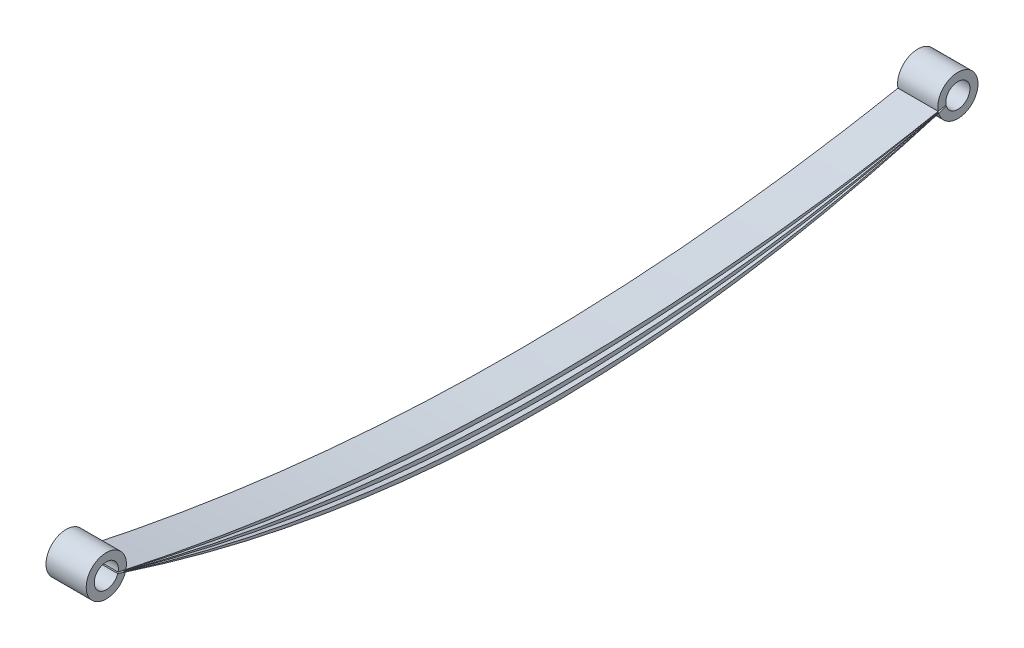
ISO-10303-21;
HEADER;
FILE_DESCRIPTION(('STEP AP214'),'2;1');
FILE_NAME('part.step','',(''),(''),'','','');
FILE_SCHEMA(('AUTOMOTIVE_DESIGN { 1 0 10303 214 1 1 1 1 }'));
ENDSEC;
DATA;
#1=APPLICATION_CONTEXT('core data for automotive mechanical design processes');
#2=APPLICATION_PROTOCOL_DEFINITION('international standard','automotive_design',2000,#1);
#3=PRODUCT_CONTEXT('',#1,'mechanical');
#4=PRODUCT('Part','Part','',(#3));
#5=PRODUCT_RELATED_PRODUCT_CATEGORY('part','',(#4));
#6=PRODUCT_DEFINITION_FORMATION('','',#4);
#7=PRODUCT_DEFINITION_CONTEXT('part definition',#1,'design');
#8=PRODUCT_DEFINITION('design','',#6,#7);
#9=PRODUCT_DEFINITION_SHAPE('','',#8);
#10=(LENGTH_UNIT() NAMED_UNIT(*) SI_UNIT(.MILLI.,.METRE.));
#11=(NAMED_UNIT(*) PLANE_ANGLE_UNIT() SI_UNIT($,.RADIAN.));
#12=(NAMED_UNIT(*) SI_UNIT($,.STERADIAN.) SOLID_ANGLE_UNIT());
#13=UNCERTAINTY_MEASURE_WITH_UNIT(LENGTH_MEASURE(1.E-05),#10,'distance_accuracy_value','');
#14=(GEOMETRIC_REPRESENTATION_CONTEXT(3) GLOBAL_UNCERTAINTY_ASSIGNED_CONTEXT((#13)) GLOBAL_UNIT_ASSIGNED_CONTEXT((#10,
#11,#12)) REPRESENTATION_CONTEXT('',''));
#15=CARTESIAN_POINT('',(0.,0.,0.));
#16=DIRECTION('',(0.,0.,1.));
#17=DIRECTION('',(1.,0.,0.));
#18=AXIS2_PLACEMENT_3D('',#15,#16,#17);
#19=CARTESIAN_POINT('',(5.,43.9760480272873,40.5628575819463));
#20=CARTESIAN_POINT('',(5.,26.1373404428306,-12.0964006397239));
#21=CARTESIAN_POINT('',(5.,42.7573695652936,-65.3271424180537));
#22=B_SPLINE_CURVE_WITH_KNOTS('',2,(#19,#20,#21),.UNSPECIFIED.,.F.,.F.,(3,3),(0.,1.),.UNSPECIFIED.);
#23=DIRECTION('',(-1.,0.,0.));
#24=VECTOR('',#23,1.);
#25=SURFACE_OF_LINEAR_EXTRUSION('',#22,#24);
#26=DIRECTION('',(-1.,0.,0.));
#27=VECTOR('',#26,1.);
#28=CARTESIAN_POINT('',(5.,42.3159824713809,-63.8935534137267));
#29=LINE('',#28,#27);
#30=CARTESIAN_POINT('',(0.,42.3159824713809,-63.8935534137266));
#31=VERTEX_POINT('',#30);
#32=CARTESIAN_POINT('',(5.,42.3159824713809,-63.8935534137266));
#33=VERTEX_POINT('',#32);
#34=EDGE_CURVE('E483',#31,#33,#29,.F.);
#35=ORIENTED_EDGE('',*,*,#34,.F.);
#36=CARTESIAN_POINT('',(0.,43.9760480272873,40.5628575819463));
#37=CARTESIAN_POINT('',(0.,26.1373404428306,-12.0964006397239));
#38=CARTESIAN_POINT('',(0.,42.7573695652936,-65.3271424180537));
#39=B_SPLINE_CURVE_WITH_KNOTS('',2,(#36,#37,#38),.UNSPECIFIED.,.F.,.F.,(3,3),(0.,1.),.UNSPECIFIED.);
#40=CARTESIAN_POINT('',(0.,42.0280559752447,-62.9358871645581));
#41=VERTEX_POINT('',#40);
#42=EDGE_CURVE('E481',#41,#31,#39,.T.);
#43=ORIENTED_EDGE('',*,*,#42,.F.);
#44=DIRECTION('',(-1.,0.,0.));
#45=VECTOR('',#44,1.);
#46=CARTESIAN_POINT('',(5.,42.0280559752447,-62.9358871645581));
#47=LINE('',#46,#45);
#48=CARTESIAN_POINT('',(5.,42.0280559752447,-62.9358871645581));
#49=VERTEX_POINT('',#48);
#50=EDGE_CURVE('E438',#49,#41,#47,.T.);
#51=ORIENTED_EDGE('',*,*,#50,.F.);
#52=EDGE_CURVE('E477',#49,#33,#22,.T.);
#53=ORIENTED_EDGE('',*,*,#52,.T.);
#54=EDGE_LOOP('',(#35,#43,#51,#53));
#55=FACE_BOUND('',#54,.T.);
#56=ADVANCED_FACE('F430',(#55),#25,.T.);
#57=CARTESIAN_POINT('',(5.,42.7573695652936,-65.3271424180537));
#58=DIRECTION('',(-1.,0.,0.));
#59=DIRECTION('',(0.,0.,1.));
#60=AXIS2_PLACEMENT_3D('',#57,#58,#59);
#61=CYLINDRICAL_SURFACE('',#60,2.50000000000001);
#62=CARTESIAN_POINT('',(0.,42.7573695652936,-65.3271424180537));
#63=DIRECTION('',(1.,0.,0.));
#64=DIRECTION('',(0.,0.,-1.));
#65=AXIS2_PLACEMENT_3D('',#62,#63,#64);
#66=CIRCLE('',#65,2.50000000000001);
#67=CARTESIAN_POINT('',(0.,42.2711989196782,-62.8748703892318));
#68=VERTEX_POINT('',#67);
#69=EDGE_CURVE('E476',#68,#41,#66,.F.);
#70=ORIENTED_EDGE('',*,*,#69,.F.);
#71=DIRECTION('',(-1.,0.,0.));
#72=VECTOR('',#71,1.);
#73=CARTESIAN_POINT('',(5.,42.2711989196782,-62.8748703892318));
#74=LINE('',#73,#72);
#75=CARTESIAN_POINT('',(5.,42.2711989196782,-62.8748703892318));
#76=VERTEX_POINT('',#75);
#77=EDGE_CURVE('E453',#76,#68,#74,.T.);
#78=ORIENTED_EDGE('',*,*,#77,.F.);
#79=CARTESIAN_POINT('',(5.,42.7573695652936,-65.3271424180537));
#80=DIRECTION('',(1.,0.,0.));
#81=DIRECTION('',(0.,0.,-1.));
#82=AXIS2_PLACEMENT_3D('',#79,#80,#81);
#83=CIRCLE('',#82,2.50000000000001);
#84=EDGE_CURVE('E500',#76,#49,#83,.F.);
#85=ORIENTED_EDGE('',*,*,#84,.T.);
#86=ORIENTED_EDGE('',*,*,#50,.T.);
#87=EDGE_LOOP('',(#70,#78,#85,#86));
#88=FACE_BOUND('',#87,.T.);
#89=ADVANCED_FACE('F479',(#88),#61,.T.);
#90=CARTESIAN_POINT('',(5.,43.9760480272873,40.5628575819463));
#91=CARTESIAN_POINT('',(5.,31.9781728916656,-12.2818292066878));
#92=CARTESIAN_POINT('',(5.,42.7573695652936,-65.3271424180537));
#93=B_SPLINE_CURVE_WITH_KNOTS('',2,(#90,#91,#92),.UNSPECIFIED.,.F.,.F.,(3,3),(0.,1.),.UNSPECIFIED.);
#94=DIRECTION('',(-1.,0.,0.));
#95=VECTOR('',#94,1.);
#96=SURFACE_OF_LINEAR_EXTRUSION('',#93,#95);
#97=CARTESIAN_POINT('',(0.,43.9760480272873,40.5628575819463));
#98=CARTESIAN_POINT('',(0.,31.9781728916656,-12.2818292066878));
#99=CARTESIAN_POINT('',(0.,42.7573695652936,-65.3271424180537));
#100=B_SPLINE_CURVE_WITH_KNOTS('',2,(#97,#98,#99),.UNSPECIFIED.,.F.,.F.,(3,3),(0.,1.),.UNSPECIFIED.);
#101=CARTESIAN_POINT('',(0.,42.4628615333455,-63.8563382097617));
#102=VERTEX_POINT('',#101);
#103=EDGE_CURVE('E467',#68,#102,#100,.T.);
#104=ORIENTED_EDGE('',*,*,#103,.T.);
#105=DIRECTION('',(-1.,0.,0.));
#106=VECTOR('',#105,1.);
#107=CARTESIAN_POINT('',(5.,42.4628615333451,-63.8563382097596));
#108=LINE('',#107,#106);
#109=CARTESIAN_POINT('',(5.,42.4628615333463,-63.8563382097654));
#110=VERTEX_POINT('',#109);
#111=EDGE_CURVE('E445',#102,#110,#108,.F.);
#112=ORIENTED_EDGE('',*,*,#111,.T.);
#113=EDGE_CURVE('E469',#76,#110,#93,.T.);
#114=ORIENTED_EDGE('',*,*,#113,.F.);
#115=ORIENTED_EDGE('',*,*,#77,.T.);
#116=EDGE_LOOP('',(#104,#112,#114,#115));
#117=FACE_BOUND('',#116,.T.);
#118=ADVANCED_FACE('F466',(#117),#96,.F.);
#119=CARTESIAN_POINT('',(5.,0.,0.));
#120=DIRECTION('',(1.,0.,0.));
#121=DIRECTION('',(0.,0.,-1.));
#122=AXIS2_PLACEMENT_3D('',#119,#120,#121);
#123=PLANE('',#122);
#124=CARTESIAN_POINT('',(5.,42.7573695652936,-65.3271424180537));
#125=DIRECTION('',(-1.,0.,0.));
#126=DIRECTION('',(0.,0.,1.));
#127=AXIS2_PLACEMENT_3D('',#124,#125,#126);
#128=CIRCLE('',#127,1.5);
#129=EDGE_CURVE('E524',#110,#33,#128,.T.);
#130=ORIENTED_EDGE('',*,*,#129,.T.);
#131=ORIENTED_EDGE('',*,*,#52,.F.);
#132=ORIENTED_EDGE('',*,*,#84,.F.);
#133=ORIENTED_EDGE('',*,*,#113,.T.);
#134=EDGE_LOOP('',(#130,#131,#132,#133));
#135=FACE_BOUND('',#134,.T.);
#136=ADVANCED_FACE('F507',(#135),#123,.T.);
#137=CARTESIAN_POINT('',(0.,0.,0.));
#138=DIRECTION('',(1.,0.,0.));
#139=DIRECTION('',(0.,0.,-1.));
#140=AXIS2_PLACEMENT_3D('',#137,#138,#139);
#141=PLANE('',#140);
#142=ORIENTED_EDGE('',*,*,#42,.T.);
#143=CARTESIAN_POINT('',(0.,42.7573695652936,-65.3271424180537));
#144=DIRECTION('',(1.,0.,0.));
#145=DIRECTION('',(0.,0.,-1.));
#146=AXIS2_PLACEMENT_3D('',#143,#144,#145);
#147=CIRCLE('',#146,1.5);
#148=EDGE_CURVE('E13',#31,#102,#147,.T.);
#149=ORIENTED_EDGE('',*,*,#148,.T.);
#150=ORIENTED_EDGE('',*,*,#103,.F.);
#151=ORIENTED_EDGE('',*,*,#69,.T.);
#152=EDGE_LOOP('',(#142,#149,#150,#151));
#153=FACE_BOUND('',#152,.T.);
#154=ADVANCED_FACE('F475',(#153),#141,.F.);
#155=CARTESIAN_POINT('',(5.,42.7573695652936,-65.3271424180537));
#156=DIRECTION('',(-1.,0.,0.));
#157=DIRECTION('',(0.,0.,1.));
#158=AXIS2_PLACEMENT_3D('',#155,#156,#157);
#159=CYLINDRICAL_SURFACE('',#158,1.5);
#160=ORIENTED_EDGE('',*,*,#34,.T.);
#161=ORIENTED_EDGE('',*,*,#129,.F.);
#162=ORIENTED_EDGE('',*,*,#111,.F.);
#163=ORIENTED_EDGE('',*,*,#148,.F.);
#164=EDGE_LOOP('',(#160,#161,#162,#163));
#165=FACE_BOUND('',#164,.T.);
#166=ADVANCED_FACE('F535',(#165),#159,.F.);
#167=CLOSED_SHELL('',(#56,#89,#118,#136,#154,#166));
#168=MANIFOLD_SOLID_BREP('B2',#167);
#169=CARTESIAN_POINT('',(5.,43.9760480272873,40.5628575819463));
#170=CARTESIAN_POINT('',(5.,26.1373404428306,-12.0964006397239));
#171=CARTESIAN_POINT('',(5.,42.7573695652936,-65.3271424180537));
#172=B_SPLINE_CURVE_WITH_KNOTS('',2,(#169,#170,#171),.UNSPECIFIED.,.F.,.F.,(3,3),(0.,1.),.UNSPECIFIED.);
#173=DIRECTION('',(-1.,0.,0.));
#174=VECTOR('',#173,1.);
#175=SURFACE_OF_LINEAR_EXTRUSION('',#172,#174);
#176=DIRECTION('',(-1.,0.,0.));
#177=VECTOR('',#176,1.);
#178=CARTESIAN_POINT('',(5.,43.5004514863159,39.140251547158));
#179=LINE('',#178,#177);
#180=CARTESIAN_POINT('',(5.,43.5004514863159,39.140251547158));
#181=VERTEX_POINT('',#180);
#182=CARTESIAN_POINT('',(0.,43.5004514863159,39.140251547158));
#183=VERTEX_POINT('',#182);
#184=EDGE_CURVE('E601',#181,#183,#179,.T.);
#185=ORIENTED_EDGE('',*,*,#184,.F.);
#186=CARTESIAN_POINT('',(5.,43.1897259974283,38.1897377650474));
#187=VERTEX_POINT('',#186);
#188=EDGE_CURVE('E608',#181,#187,#172,.T.);
#189=ORIENTED_EDGE('',*,*,#188,.T.);
#190=DIRECTION('',(-1.,0.,0.));
#191=VECTOR('',#190,1.);
#192=CARTESIAN_POINT('',(5.,43.1897259974283,38.1897377650474));
#193=LINE('',#192,#191);
#194=CARTESIAN_POINT('',(0.,43.1897259974283,38.1897377650474));
#195=VERTEX_POINT('',#194);
#196=EDGE_CURVE('E630',#187,#195,#193,.T.);
#197=ORIENTED_EDGE('',*,*,#196,.T.);
#198=CARTESIAN_POINT('',(0.,43.9760480272873,40.5628575819463));
#199=CARTESIAN_POINT('',(0.,26.1373404428306,-12.0964006397239));
#200=CARTESIAN_POINT('',(0.,42.7573695652936,-65.3271424180537));
#201=B_SPLINE_CURVE_WITH_KNOTS('',2,(#198,#199,#200),.UNSPECIFIED.,.F.,.F.,(3,3),(0.,1.),.UNSPECIFIED.);
#202=EDGE_CURVE('E622',#183,#195,#201,.T.);
#203=ORIENTED_EDGE('',*,*,#202,.F.);
#204=EDGE_LOOP('',(#185,#189,#197,#203));
#205=FACE_BOUND('',#204,.T.);
#206=ADVANCED_FACE('F586',(#205),#175,.T.);
#207=CARTESIAN_POINT('',(5.,43.9760480272873,40.5628575819463));
#208=CARTESIAN_POINT('',(5.,31.9781728916656,-12.2818292066878));
#209=CARTESIAN_POINT('',(5.,42.7573695652936,-65.3271424180537));
#210=B_SPLINE_CURVE_WITH_KNOTS('',2,(#207,#208,#209),.UNSPECIFIED.,.F.,.F.,(3,3),(0.,1.),.UNSPECIFIED.);
#211=DIRECTION('',(-1.,0.,0.));
#212=VECTOR('',#211,1.);
#213=SURFACE_OF_LINEAR_EXTRUSION('',#210,#212);
#214=CARTESIAN_POINT('',(5.,43.6481035505989,39.0991457181529));
#215=VERTEX_POINT('',#214);
#216=CARTESIAN_POINT('',(5.,43.4341123847639,38.1223031860431));
#217=VERTEX_POINT('',#216);
#218=EDGE_CURVE('E639',#215,#217,#210,.T.);
#219=ORIENTED_EDGE('',*,*,#218,.F.);
#220=DIRECTION('',(-1.,0.,0.));
#221=VECTOR('',#220,1.);
#222=CARTESIAN_POINT('',(5.,43.6481035505989,39.0991457181529));
#223=LINE('',#222,#221);
#224=CARTESIAN_POINT('',(0.,43.6481035505989,39.0991457181529));
#225=VERTEX_POINT('',#224);
#226=EDGE_CURVE('E721',#215,#225,#223,.T.);
#227=ORIENTED_EDGE('',*,*,#226,.T.);
#228=CARTESIAN_POINT('',(0.,43.9760480272873,40.5628575819463));
#229=CARTESIAN_POINT('',(0.,31.9781728916656,-12.2818292066878));
#230=CARTESIAN_POINT('',(0.,42.7573695652936,-65.3271424180537));
#231=B_SPLINE_CURVE_WITH_KNOTS('',2,(#228,#229,#230),.UNSPECIFIED.,.F.,.F.,(3,3),(0.,1.),.UNSPECIFIED.);
#232=CARTESIAN_POINT('',(0.,43.4341123847639,38.1223031860431));
#233=VERTEX_POINT('',#232);
#234=EDGE_CURVE('E627',#225,#233,#231,.T.);
#235=ORIENTED_EDGE('',*,*,#234,.T.);
#236=DIRECTION('',(-1.,0.,0.));
#237=VECTOR('',#236,1.);
#238=CARTESIAN_POINT('',(5.,43.4341123847639,38.1223031860431));
#239=LINE('',#238,#237);
#240=EDGE_CURVE('E594',#217,#233,#239,.T.);
#241=ORIENTED_EDGE('',*,*,#240,.F.);
#242=EDGE_LOOP('',(#219,#227,#235,#241));
#243=FACE_BOUND('',#242,.T.);
#244=ADVANCED_FACE('F663',(#243),#213,.F.);
#245=CARTESIAN_POINT('',(5.,43.9760480272873,40.5628575819463));
#246=DIRECTION('',(-1.,0.,0.));
#247=DIRECTION('',(0.,0.,1.));
#248=AXIS2_PLACEMENT_3D('',#245,#246,#247);
#249=CYLINDRICAL_SURFACE('',#248,2.5);
#250=CARTESIAN_POINT('',(0.,43.9760480272873,40.5628575819463));
#251=DIRECTION('',(1.,0.,0.));
#252=DIRECTION('',(0.,0.,-1.));
#253=AXIS2_PLACEMENT_3D('',#250,#251,#252);
#254=CIRCLE('',#253,2.5);
#255=EDGE_CURVE('E626',#233,#195,#254,.T.);
#256=ORIENTED_EDGE('',*,*,#255,.T.);
#257=ORIENTED_EDGE('',*,*,#196,.F.);
#258=CARTESIAN_POINT('',(5.,43.9760480272873,40.5628575819463));
#259=DIRECTION('',(1.,0.,0.));
#260=DIRECTION('',(0.,0.,-1.));
#261=AXIS2_PLACEMENT_3D('',#258,#259,#260);
#262=CIRCLE('',#261,2.5);
#263=EDGE_CURVE('E633',#217,#187,#262,.T.);
#264=ORIENTED_EDGE('',*,*,#263,.F.);
#265=ORIENTED_EDGE('',*,*,#240,.T.);
#266=EDGE_LOOP('',(#256,#257,#264,#265));
#267=FACE_BOUND('',#266,.T.);
#268=ADVANCED_FACE('F636',(#267),#249,.T.);
#269=CARTESIAN_POINT('',(5.,0.,0.));
#270=DIRECTION('',(1.,0.,0.));
#271=DIRECTION('',(0.,0.,-1.));
#272=AXIS2_PLACEMENT_3D('',#269,#270,#271);
#273=PLANE('',#272);
#274=CARTESIAN_POINT('',(5.,43.9760480272873,40.5628575819463));
#275=DIRECTION('',(-1.,0.,0.));
#276=DIRECTION('',(0.,0.,1.));
#277=AXIS2_PLACEMENT_3D('',#274,#275,#276);
#278=CIRCLE('',#277,1.5);
#279=EDGE_CURVE('E716',#181,#215,#278,.T.);
#280=ORIENTED_EDGE('',*,*,#279,.T.);
#281=ORIENTED_EDGE('',*,*,#218,.T.);
#282=ORIENTED_EDGE('',*,*,#263,.T.);
#283=ORIENTED_EDGE('',*,*,#188,.F.);
#284=EDGE_LOOP('',(#280,#281,#282,#283));
#285=FACE_BOUND('',#284,.T.);
#286=ADVANCED_FACE('F669',(#285),#273,.T.);
#287=CARTESIAN_POINT('',(0.,0.,0.));
#288=DIRECTION('',(1.,0.,0.));
#289=DIRECTION('',(0.,0.,-1.));
#290=AXIS2_PLACEMENT_3D('',#287,#288,#289);
#291=PLANE('',#290);
#292=ORIENTED_EDGE('',*,*,#234,.F.);
#293=CARTESIAN_POINT('',(0.,43.9760480272873,40.5628575819463));
#294=DIRECTION('',(1.,0.,0.));
#295=DIRECTION('',(0.,0.,-1.));
#296=AXIS2_PLACEMENT_3D('',#293,#294,#295);
#297=CIRCLE('',#296,1.5);
#298=EDGE_CURVE('E428',#225,#183,#297,.T.);
#299=ORIENTED_EDGE('',*,*,#298,.T.);
#300=ORIENTED_EDGE('',*,*,#202,.T.);
#301=ORIENTED_EDGE('',*,*,#255,.F.);
#302=EDGE_LOOP('',(#292,#299,#300,#301));
#303=FACE_BOUND('',#302,.T.);
#304=ADVANCED_FACE('F624',(#303),#291,.F.);
#305=CARTESIAN_POINT('',(5.,43.9760480272873,40.5628575819463));
#306=DIRECTION('',(-1.,0.,0.));
#307=DIRECTION('',(0.,0.,1.));
#308=AXIS2_PLACEMENT_3D('',#305,#306,#307);
#309=CYLINDRICAL_SURFACE('',#308,1.5);
#310=ORIENTED_EDGE('',*,*,#184,.T.);
#311=ORIENTED_EDGE('',*,*,#298,.F.);
#312=ORIENTED_EDGE('',*,*,#226,.F.);
#313=ORIENTED_EDGE('',*,*,#279,.F.);
#314=EDGE_LOOP('',(#310,#311,#312,#313));
#315=FACE_BOUND('',#314,.T.);
#316=ADVANCED_FACE('F672',(#315),#309,.F.);
#317=CLOSED_SHELL('',(#206,#244,#268,#286,#304,#316));
#318=MANIFOLD_SOLID_BREP('B7',#317);
#319=CARTESIAN_POINT('',(5.,43.9760480272873,40.5628575819463));
#320=DIRECTION('',(-1.,0.,0.));
#321=DIRECTION('',(0.,0.,1.));
#322=AXIS2_PLACEMENT_3D('',#319,#320,#321);
#323=CYLINDRICAL_SURFACE('',#322,2.5);
#324=CARTESIAN_POINT('',(0.,43.9760480272873,40.5628575819463));
#325=DIRECTION('',(1.,0.,0.));
#326=DIRECTION('',(0.,0.,-1.));
#327=AXIS2_PLACEMENT_3D('',#324,#325,#326);
#328=CIRCLE('',#327,2.5);
#329=CARTESIAN_POINT('',(0.,43.1897259974283,38.1897377650474));
#330=VERTEX_POINT('',#329);
#331=CARTESIAN_POINT('',(0.,43.2336437362485,38.1756341176165));
#332=VERTEX_POINT('',#331);
#333=EDGE_CURVE('E816',#330,#332,#328,.T.);
#334=ORIENTED_EDGE('',*,*,#333,.F.);
#335=DIRECTION('',(-1.,0.,0.));
#336=VECTOR('',#335,1.);
#337=CARTESIAN_POINT('',(5.,43.1897259974283,38.1897377650474));
#338=LINE('',#337,#336);
#339=CARTESIAN_POINT('',(5.,43.1897259974283,38.1897377650474));
#340=VERTEX_POINT('',#339);
#341=EDGE_CURVE('E584',#340,#330,#338,.T.);
#342=ORIENTED_EDGE('',*,*,#341,.F.);
#343=CARTESIAN_POINT('',(5.,43.9760480272873,40.5628575819463));
#344=DIRECTION('',(1.,0.,0.));
#345=DIRECTION('',(0.,0.,-1.));
#346=AXIS2_PLACEMENT_3D('',#343,#344,#345);
#347=CIRCLE('',#346,2.5);
#348=CARTESIAN_POINT('',(5.,43.2336437362485,38.1756341176165));
#349=VERTEX_POINT('',#348);
#350=EDGE_CURVE('E791',#340,#349,#347,.T.);
#351=ORIENTED_EDGE('',*,*,#350,.T.);
#352=DIRECTION('',(-1.,0.,0.));
#353=VECTOR('',#352,1.);
#354=CARTESIAN_POINT('',(5.,43.2336437362485,38.1756341176165));
#355=LINE('',#354,#353);
#356=EDGE_CURVE('E759',#349,#332,#355,.T.);
#357=ORIENTED_EDGE('',*,*,#356,.T.);
#358=EDGE_LOOP('',(#334,#342,#351,#357));
#359=FACE_BOUND('',#358,.T.);
#360=ADVANCED_FACE('F742',(#359),#323,.F.);
#361=CARTESIAN_POINT('',(5.,43.9760480272873,40.5628575819463));
#362=CARTESIAN_POINT('',(5.,26.1373404428306,-12.0964006397239));
#363=CARTESIAN_POINT('',(5.,42.7573695652936,-65.3271424180537));
#364=B_SPLINE_CURVE_WITH_KNOTS('',2,(#361,#362,#363),.UNSPECIFIED.,.F.,.F.,(3,3),(0.,1.),.UNSPECIFIED.);
#365=DIRECTION('',(-1.,0.,0.));
#366=VECTOR('',#365,1.);
#367=SURFACE_OF_LINEAR_EXTRUSION('',#364,#366);
#368=CARTESIAN_POINT('',(0.,43.9760480272873,40.5628575819463));
#369=CARTESIAN_POINT('',(0.,26.1373404428306,-12.0964006397239));
#370=CARTESIAN_POINT('',(0.,42.7573695652936,-65.3271424180537));
#371=B_SPLINE_CURVE_WITH_KNOTS('',2,(#368,#369,#370),.UNSPECIFIED.,.F.,.F.,(3,3),(0.,1.),.UNSPECIFIED.);
#372=CARTESIAN_POINT('',(0.,42.0280559752447,-62.9358871645581));
#373=VERTEX_POINT('',#372);
#374=EDGE_CURVE('E798',#330,#373,#371,.T.);
#375=ORIENTED_EDGE('',*,*,#374,.T.);
#376=DIRECTION('',(-1.,0.,0.));
#377=VECTOR('',#376,1.);
#378=CARTESIAN_POINT('',(5.,42.0280559752447,-62.9358871645581));
#379=LINE('',#378,#377);
#380=CARTESIAN_POINT('',(5.,42.0280559752447,-62.9358871645581));
#381=VERTEX_POINT('',#380);
#382=EDGE_CURVE('E751',#381,#373,#379,.T.);
#383=ORIENTED_EDGE('',*,*,#382,.F.);
#384=EDGE_CURVE('E785',#340,#381,#364,.T.);
#385=ORIENTED_EDGE('',*,*,#384,.F.);
#386=ORIENTED_EDGE('',*,*,#341,.T.);
#387=EDGE_LOOP('',(#375,#383,#385,#386));
#388=FACE_BOUND('',#387,.T.);
#389=ADVANCED_FACE('F796',(#388),#367,.F.);
#390=CARTESIAN_POINT('',(5.,42.7573695652936,-65.3271424180537));
#391=DIRECTION('',(-1.,0.,0.));
#392=DIRECTION('',(0.,0.,1.));
#393=AXIS2_PLACEMENT_3D('',#390,#391,#392);
#394=CYLINDRICAL_SURFACE('',#393,2.50000000000001);
#395=CARTESIAN_POINT('',(0.,42.7573695652936,-65.3271424180537));
#396=DIRECTION('',(1.,0.,0.));
#397=DIRECTION('',(0.,0.,-1.));
#398=AXIS2_PLACEMENT_3D('',#395,#396,#397);
#399=CIRCLE('',#398,2.50000000000001);
#400=CARTESIAN_POINT('',(0.,42.0719404465231,-62.9229404874452));
#401=VERTEX_POINT('',#400);
#402=EDGE_CURVE('E839',#373,#401,#399,.F.);
#403=ORIENTED_EDGE('',*,*,#402,.T.);
#404=DIRECTION('',(-1.,0.,0.));
#405=VECTOR('',#404,1.);
#406=CARTESIAN_POINT('',(5.,42.0719404465231,-62.9229404874452));
#407=LINE('',#406,#405);
#408=CARTESIAN_POINT('',(5.,42.0719404465231,-62.9229404874452));
#409=VERTEX_POINT('',#408);
#410=EDGE_CURVE('E773',#409,#401,#407,.T.);
#411=ORIENTED_EDGE('',*,*,#410,.F.);
#412=CARTESIAN_POINT('',(5.,42.7573695652936,-65.3271424180537));
#413=DIRECTION('',(1.,0.,0.));
#414=DIRECTION('',(0.,0.,-1.));
#415=AXIS2_PLACEMENT_3D('',#412,#413,#414);
#416=CIRCLE('',#415,2.50000000000001);
#417=EDGE_CURVE('E790',#381,#409,#416,.F.);
#418=ORIENTED_EDGE('',*,*,#417,.F.);
#419=ORIENTED_EDGE('',*,*,#382,.T.);
#420=EDGE_LOOP('',(#403,#411,#418,#419));
#421=FACE_BOUND('',#420,.T.);
#422=ADVANCED_FACE('F802',(#421),#394,.F.);
#423=CARTESIAN_POINT('',(5.,43.9760480272873,40.5628575819463));
#424=CARTESIAN_POINT('',(5.,27.2249188842183,-12.1190833230216));
#425=CARTESIAN_POINT('',(5.,42.7573695652936,-65.3271424180537));
#426=B_SPLINE_CURVE_WITH_KNOTS('',2,(#423,#424,#425),.UNSPECIFIED.,.F.,.F.,(3,3),(0.,1.),.UNSPECIFIED.);
#427=DIRECTION('',(-1.,0.,0.));
#428=VECTOR('',#427,1.);
#429=SURFACE_OF_LINEAR_EXTRUSION('',#426,#428);
#430=CARTESIAN_POINT('',(0.,43.9760480272873,40.5628575819463));
#431=CARTESIAN_POINT('',(0.,27.2249188842183,-12.1190833230216));
#432=CARTESIAN_POINT('',(0.,42.7573695652936,-65.3271424180537));
#433=B_SPLINE_CURVE_WITH_KNOTS('',2,(#430,#431,#432),.UNSPECIFIED.,.F.,.F.,(3,3),(0.,1.),.UNSPECIFIED.);
#434=EDGE_CURVE('E841',#332,#401,#433,.T.);
#435=ORIENTED_EDGE('',*,*,#434,.F.);
#436=ORIENTED_EDGE('',*,*,#356,.F.);
#437=EDGE_CURVE('E804',#349,#409,#426,.T.);
#438=ORIENTED_EDGE('',*,*,#437,.T.);
#439=ORIENTED_EDGE('',*,*,#410,.T.);
#440=EDGE_LOOP('',(#435,#436,#438,#439));
#441=FACE_BOUND('',#440,.T.);
#442=ADVANCED_FACE('F822',(#441),#429,.T.);
#443=CARTESIAN_POINT('',(5.,0.,0.));
#444=DIRECTION('',(1.,0.,0.));
#445=DIRECTION('',(0.,0.,-1.));
#446=AXIS2_PLACEMENT_3D('',#443,#444,#445);
#447=PLANE('',#446);
#448=ORIENTED_EDGE('',*,*,#350,.F.);
#449=ORIENTED_EDGE('',*,*,#384,.T.);
#450=ORIENTED_EDGE('',*,*,#417,.T.);
#451=ORIENTED_EDGE('',*,*,#437,.F.);
#452=EDGE_LOOP('',(#448,#449,#450,#451));
#453=FACE_BOUND('',#452,.T.);
#454=ADVANCED_FACE('F787',(#453),#447,.T.);
#455=CARTESIAN_POINT('',(0.,0.,0.));
#456=DIRECTION('',(1.,0.,0.));
#457=DIRECTION('',(0.,0.,-1.));
#458=AXIS2_PLACEMENT_3D('',#455,#456,#457);
#459=PLANE('',#458);
#460=ORIENTED_EDGE('',*,*,#333,.T.);
#461=ORIENTED_EDGE('',*,*,#434,.T.);
#462=ORIENTED_EDGE('',*,*,#402,.F.);
#463=ORIENTED_EDGE('',*,*,#374,.F.);
#464=EDGE_LOOP('',(#460,#461,#462,#463));
#465=FACE_BOUND('',#464,.T.);
#466=ADVANCED_FACE('F826',(#465),#459,.F.);
#467=CLOSED_SHELL('',(#360,#389,#422,#442,#454,#466));
#468=MANIFOLD_SOLID_BREP('B422',#467);
#469=CARTESIAN_POINT('',(5.,43.9760480272873,40.5628575819463));
#470=DIRECTION('',(-1.,0.,0.));
#471=DIRECTION('',(0.,0.,1.));
#472=AXIS2_PLACEMENT_3D('',#469,#470,#471);
#473=CYLINDRICAL_SURFACE('',#472,2.5);
#474=CARTESIAN_POINT('',(0.,43.9760480272873,40.5628575819463));
#475=DIRECTION('',(1.,0.,0.));
#476=DIRECTION('',(0.,0.,-1.));
#477=AXIS2_PLACEMENT_3D('',#474,#475,#476);
#478=CIRCLE('',#477,2.5);
#479=CARTESIAN_POINT('',(0.,43.287376898989,38.1595823007835));
#480=VERTEX_POINT('',#479);
#481=CARTESIAN_POINT('',(0.,43.3313150719601,38.1474239943031));
#482=VERTEX_POINT('',#481);
#483=EDGE_CURVE('E978',#480,#482,#478,.T.);
#484=ORIENTED_EDGE('',*,*,#483,.F.);
#485=DIRECTION('',(-1.,0.,0.));
#486=VECTOR('',#485,1.);
#487=CARTESIAN_POINT('',(5.,43.287376898989,38.1595823007835));
#488=LINE('',#487,#486);
#489=CARTESIAN_POINT('',(5.,43.287376898989,38.1595823007835));
#490=VERTEX_POINT('',#489);
#491=EDGE_CURVE('E740',#490,#480,#488,.T.);
#492=ORIENTED_EDGE('',*,*,#491,.F.);
#493=CARTESIAN_POINT('',(5.,43.9760480272873,40.5628575819463));
#494=DIRECTION('',(1.,0.,0.));
#495=DIRECTION('',(0.,0.,-1.));
#496=AXIS2_PLACEMENT_3D('',#493,#494,#495);
#497=CIRCLE('',#496,2.5);
#498=CARTESIAN_POINT('',(5.,43.3313150719601,38.1474239943031));
#499=VERTEX_POINT('',#498);
#500=EDGE_CURVE('E957',#490,#499,#497,.T.);
#501=ORIENTED_EDGE('',*,*,#500,.T.);
#502=DIRECTION('',(-1.,0.,0.));
#503=VECTOR('',#502,1.);
#504=CARTESIAN_POINT('',(5.,43.3313150719601,38.1474239943031));
#505=LINE('',#504,#503);
#506=EDGE_CURVE('E925',#499,#482,#505,.T.);
#507=ORIENTED_EDGE('',*,*,#506,.T.);
#508=EDGE_LOOP('',(#484,#492,#501,#507));
#509=FACE_BOUND('',#508,.T.);
#510=ADVANCED_FACE('F909',(#509),#473,.F.);
#511=CARTESIAN_POINT('',(5.,43.9760480272873,40.5628575819463));
#512=CARTESIAN_POINT('',(5.,28.4993517667775,-12.2638061163554));
#513=CARTESIAN_POINT('',(5.,42.7573695652936,-65.3271424180537));
#514=B_SPLINE_CURVE_WITH_KNOTS('',2,(#511,#512,#513),.UNSPECIFIED.,.F.,.F.,(3,3),(0.,1.),.UNSPECIFIED.);
#515=DIRECTION('',(-1.,0.,0.));
#516=VECTOR('',#515,1.);
#517=SURFACE_OF_LINEAR_EXTRUSION('',#514,#516);
#518=CARTESIAN_POINT('',(0.,43.9760480272873,40.5628575819463));
#519=CARTESIAN_POINT('',(0.,28.4993517667775,-12.2638061163554));
#520=CARTESIAN_POINT('',(0.,42.7573695652936,-65.3271424180537));
#521=B_SPLINE_CURVE_WITH_KNOTS('',2,(#518,#519,#520),.UNSPECIFIED.,.F.,.F.,(3,3),(0.,1.),.UNSPECIFIED.);
#522=CARTESIAN_POINT('',(0.,42.1230157297736,-62.9089622735315));
#523=VERTEX_POINT('',#522);
#524=EDGE_CURVE('E963',#480,#523,#521,.T.);
#525=ORIENTED_EDGE('',*,*,#524,.T.);
#526=DIRECTION('',(-1.,0.,0.));
#527=VECTOR('',#526,1.);
#528=CARTESIAN_POINT('',(5.,42.1230157297736,-62.9089622735315));
#529=LINE('',#528,#527);
#530=CARTESIAN_POINT('',(5.,42.1230157297736,-62.9089622735315));
#531=VERTEX_POINT('',#530);
#532=EDGE_CURVE('E917',#531,#523,#529,.T.);
#533=ORIENTED_EDGE('',*,*,#532,.F.);
#534=EDGE_CURVE('E951',#490,#531,#514,.T.);
#535=ORIENTED_EDGE('',*,*,#534,.F.);
#536=ORIENTED_EDGE('',*,*,#491,.T.);
#537=EDGE_LOOP('',(#525,#533,#535,#536));
#538=FACE_BOUND('',#537,.T.);
#539=ADVANCED_FACE('F961',(#538),#517,.F.);
#540=CARTESIAN_POINT('',(5.,42.7573695652936,-65.3271424180537));
#541=DIRECTION('',(-1.,0.,0.));
#542=DIRECTION('',(0.,0.,1.));
#543=AXIS2_PLACEMENT_3D('',#540,#541,#542);
#544=CYLINDRICAL_SURFACE('',#543,2.50000000000001);
#545=CARTESIAN_POINT('',(0.,42.7573695652936,-65.3271424180537));
#546=DIRECTION('',(1.,0.,0.));
#547=DIRECTION('',(0.,0.,-1.));
#548=AXIS2_PLACEMENT_3D('',#545,#546,#547);
#549=CIRCLE('',#548,2.50000000000001);
#550=CARTESIAN_POINT('',(0.,42.1674444731093,-62.8977415895341));
#551=VERTEX_POINT('',#550);
#552=EDGE_CURVE('E999',#523,#551,#549,.F.);
#553=ORIENTED_EDGE('',*,*,#552,.T.);
#554=DIRECTION('',(-1.,0.,0.));
#555=VECTOR('',#554,1.);
#556=CARTESIAN_POINT('',(5.,42.1674444731093,-62.8977415895341));
#557=LINE('',#556,#555);
#558=CARTESIAN_POINT('',(5.,42.1674444731093,-62.8977415895341));
#559=VERTEX_POINT('',#558);
#560=EDGE_CURVE('E939',#559,#551,#557,.T.);
#561=ORIENTED_EDGE('',*,*,#560,.F.);
#562=CARTESIAN_POINT('',(5.,42.7573695652936,-65.3271424180537));
#563=DIRECTION('',(1.,0.,0.));
#564=DIRECTION('',(0.,0.,-1.));
#565=AXIS2_PLACEMENT_3D('',#562,#563,#564);
#566=CIRCLE('',#565,2.50000000000001);
#567=EDGE_CURVE('E956',#531,#559,#566,.F.);
#568=ORIENTED_EDGE('',*,*,#567,.F.);
#569=ORIENTED_EDGE('',*,*,#532,.T.);
#570=EDGE_LOOP('',(#553,#561,#568,#569));
#571=FACE_BOUND('',#570,.T.);
#572=ADVANCED_FACE('F966',(#571),#544,.F.);
#573=CARTESIAN_POINT('',(5.,43.9760480272873,40.5628575819463));
#574=CARTESIAN_POINT('',(5.,29.5577953833747,-12.2686590605701));
#575=CARTESIAN_POINT('',(5.,42.7573695652936,-65.3271424180537));
#576=B_SPLINE_CURVE_WITH_KNOTS('',2,(#573,#574,#575),.UNSPECIFIED.,.F.,.F.,(3,3),(0.,1.),.UNSPECIFIED.);
#577=DIRECTION('',(-1.,0.,0.));
#578=VECTOR('',#577,1.);
#579=SURFACE_OF_LINEAR_EXTRUSION('',#576,#578);
#580=CARTESIAN_POINT('',(0.,43.9760480272873,40.5628575819463));
#581=CARTESIAN_POINT('',(0.,29.5577953833747,-12.2686590605701));
#582=CARTESIAN_POINT('',(0.,42.7573695652936,-65.3271424180537));
#583=B_SPLINE_CURVE_WITH_KNOTS('',2,(#580,#581,#582),.UNSPECIFIED.,.F.,.F.,(3,3),(0.,1.),.UNSPECIFIED.);
#584=EDGE_CURVE('E1000',#482,#551,#583,.T.);
#585=ORIENTED_EDGE('',*,*,#584,.F.);
#586=ORIENTED_EDGE('',*,*,#506,.F.);
#587=EDGE_CURVE('E967',#499,#559,#576,.T.);
#588=ORIENTED_EDGE('',*,*,#587,.T.);
#589=ORIENTED_EDGE('',*,*,#560,.T.);
#590=EDGE_LOOP('',(#585,#586,#588,#589));
#591=FACE_BOUND('',#590,.T.);
#592=ADVANCED_FACE('F984',(#591),#579,.T.);
#593=CARTESIAN_POINT('',(5.,0.,0.));
#594=DIRECTION('',(1.,0.,0.));
#595=DIRECTION('',(0.,0.,-1.));
#596=AXIS2_PLACEMENT_3D('',#593,#594,#595);
#597=PLANE('',#596);
#598=ORIENTED_EDGE('',*,*,#500,.F.);
#599=ORIENTED_EDGE('',*,*,#534,.T.);
#600=ORIENTED_EDGE('',*,*,#567,.T.);
#601=ORIENTED_EDGE('',*,*,#587,.F.);
#602=EDGE_LOOP('',(#598,#599,#600,#601));
#603=FACE_BOUND('',#602,.T.);
#604=ADVANCED_FACE('F953',(#603),#597,.T.);
#605=CARTESIAN_POINT('',(0.,0.,0.));
#606=DIRECTION('',(1.,0.,0.));
#607=DIRECTION('',(0.,0.,-1.));
#608=AXIS2_PLACEMENT_3D('',#605,#606,#607);
#609=PLANE('',#608);
#610=ORIENTED_EDGE('',*,*,#483,.T.);
#611=ORIENTED_EDGE('',*,*,#584,.T.);
#612=ORIENTED_EDGE('',*,*,#552,.F.);
#613=ORIENTED_EDGE('',*,*,#524,.F.);
#614=EDGE_LOOP('',(#610,#611,#612,#613));
#615=FACE_BOUND('',#614,.T.);
#616=ADVANCED_FACE('F988',(#615),#609,.F.);
#617=CLOSED_SHELL('',(#510,#539,#572,#592,#604,#616));
#618=MANIFOLD_SOLID_BREP('B578',#617);
#619=CARTESIAN_POINT('',(5.,43.9760480272873,40.5628575819463));
#620=DIRECTION('',(-1.,0.,0.));
#621=DIRECTION('',(0.,0.,1.));
#622=AXIS2_PLACEMENT_3D('',#619,#620,#621);
#623=CYLINDRICAL_SURFACE('',#622,2.5);
#624=CARTESIAN_POINT('',(0.,43.9760480272873,40.5628575819463));
#625=DIRECTION('',(1.,0.,0.));
#626=DIRECTION('',(0.,0.,-1.));
#627=AXIS2_PLACEMENT_3D('',#624,#625,#626);
#628=CIRCLE('',#627,2.5);
#629=CARTESIAN_POINT('',(0.,43.3894620087809,38.1326483640203));
#630=VERTEX_POINT('',#629);
#631=CARTESIAN_POINT('',(0.,43.4341123847639,38.1223031860431));
#632=VERTEX_POINT('',#631);
#633=EDGE_CURVE('E1124',#630,#632,#628,.T.);
#634=ORIENTED_EDGE('',*,*,#633,.F.);
#635=DIRECTION('',(-1.,0.,0.));
#636=VECTOR('',#635,1.);
#637=CARTESIAN_POINT('',(5.,43.3894620087809,38.1326483640203));
#638=LINE('',#637,#636);
#639=CARTESIAN_POINT('',(5.,43.3894620087809,38.1326483640203));
#640=VERTEX_POINT('',#639);
#641=EDGE_CURVE('E907',#640,#630,#638,.T.);
#642=ORIENTED_EDGE('',*,*,#641,.F.);
#643=CARTESIAN_POINT('',(5.,43.9760480272873,40.5628575819463));
#644=DIRECTION('',(1.,0.,0.));
#645=DIRECTION('',(0.,0.,-1.));
#646=AXIS2_PLACEMENT_3D('',#643,#644,#645);
#647=CIRCLE('',#646,2.5);
#648=CARTESIAN_POINT('',(5.,43.4341123847639,38.1223031860431));
#649=VERTEX_POINT('',#648);
#650=EDGE_CURVE('E1103',#640,#649,#647,.T.);
#651=ORIENTED_EDGE('',*,*,#650,.T.);
#652=DIRECTION('',(-1.,0.,0.));
#653=VECTOR('',#652,1.);
#654=CARTESIAN_POINT('',(5.,43.4341123847639,38.1223031860431));
#655=LINE('',#654,#653);
#656=EDGE_CURVE('E1071',#649,#632,#655,.T.);
#657=ORIENTED_EDGE('',*,*,#656,.T.);
#658=EDGE_LOOP('',(#634,#642,#651,#657));
#659=FACE_BOUND('',#658,.T.);
#660=ADVANCED_FACE('F1055',(#659),#623,.F.);
#661=CARTESIAN_POINT('',(5.,43.9760480272873,40.5628575819463));
#662=CARTESIAN_POINT('',(5.,30.9357963175356,-12.2758032679423));
#663=CARTESIAN_POINT('',(5.,42.7573695652936,-65.3271424180537));
#664=B_SPLINE_CURVE_WITH_KNOTS('',2,(#661,#662,#663),.UNSPECIFIED.,.F.,.F.,(3,3),(0.,1.),.UNSPECIFIED.);
#665=DIRECTION('',(-1.,0.,0.));
#666=VECTOR('',#665,1.);
#667=SURFACE_OF_LINEAR_EXTRUSION('',#664,#666);
#668=CARTESIAN_POINT('',(0.,43.9760480272873,40.5628575819463));
#669=CARTESIAN_POINT('',(0.,30.9357963175356,-12.2758032679423));
#670=CARTESIAN_POINT('',(0.,42.7573695652936,-65.3271424180537));
#671=B_SPLINE_CURVE_WITH_KNOTS('',2,(#668,#669,#670),.UNSPECIFIED.,.F.,.F.,(3,3),(0.,1.),.UNSPECIFIED.);
#672=CARTESIAN_POINT('',(0.,42.2261643012134,-62.8842300235103));
#673=VERTEX_POINT('',#672);
#674=EDGE_CURVE('E1109',#630,#673,#671,.T.);
#675=ORIENTED_EDGE('',*,*,#674,.T.);
#676=DIRECTION('',(-1.,0.,0.));
#677=VECTOR('',#676,1.);
#678=CARTESIAN_POINT('',(5.,42.2261643012134,-62.8842300235103));
#679=LINE('',#678,#677);
#680=CARTESIAN_POINT('',(5.,42.2261643012134,-62.8842300235103));
#681=VERTEX_POINT('',#680);
#682=EDGE_CURVE('E1063',#681,#673,#679,.T.);
#683=ORIENTED_EDGE('',*,*,#682,.F.);
#684=EDGE_CURVE('E1097',#640,#681,#664,.T.);
#685=ORIENTED_EDGE('',*,*,#684,.F.);
#686=ORIENTED_EDGE('',*,*,#641,.T.);
#687=EDGE_LOOP('',(#675,#683,#685,#686));
#688=FACE_BOUND('',#687,.T.);
#689=ADVANCED_FACE('F1107',(#688),#667,.F.);
#690=CARTESIAN_POINT('',(5.,42.7573695652936,-65.3271424180537));
#691=DIRECTION('',(-1.,0.,0.));
#692=DIRECTION('',(0.,0.,1.));
#693=AXIS2_PLACEMENT_3D('',#690,#691,#692);
#694=CYLINDRICAL_SURFACE('',#693,2.50000000000001);
#695=CARTESIAN_POINT('',(0.,42.7573695652936,-65.3271424180537));
#696=DIRECTION('',(1.,0.,0.));
#697=DIRECTION('',(0.,0.,-1.));
#698=AXIS2_PLACEMENT_3D('',#695,#696,#697);
#699=CIRCLE('',#698,2.50000000000001);
#700=CARTESIAN_POINT('',(0.,42.2711989196782,-62.8748703892318));
#701=VERTEX_POINT('',#700);
#702=EDGE_CURVE('E1145',#673,#701,#699,.F.);
#703=ORIENTED_EDGE('',*,*,#702,.T.);
#704=DIRECTION('',(-1.,0.,0.));
#705=VECTOR('',#704,1.);
#706=CARTESIAN_POINT('',(5.,42.2711989196782,-62.8748703892318));
#707=LINE('',#706,#705);
#708=CARTESIAN_POINT('',(5.,42.2711989196782,-62.8748703892318));
#709=VERTEX_POINT('',#708);
#710=EDGE_CURVE('E1085',#709,#701,#707,.T.);
#711=ORIENTED_EDGE('',*,*,#710,.F.);
#712=CARTESIAN_POINT('',(5.,42.7573695652936,-65.3271424180537));
#713=DIRECTION('',(1.,0.,0.));
#714=DIRECTION('',(0.,0.,-1.));
#715=AXIS2_PLACEMENT_3D('',#712,#713,#714);
#716=CIRCLE('',#715,2.50000000000001);
#717=EDGE_CURVE('E1102',#681,#709,#716,.F.);
#718=ORIENTED_EDGE('',*,*,#717,.F.);
#719=ORIENTED_EDGE('',*,*,#682,.T.);
#720=EDGE_LOOP('',(#703,#711,#718,#719));
#721=FACE_BOUND('',#720,.T.);
#722=ADVANCED_FACE('F1112',(#721),#694,.F.);
#723=CARTESIAN_POINT('',(5.,43.9760480272873,40.5628575819463));
#724=CARTESIAN_POINT('',(5.,31.9781728916656,-12.2818292066878));
#725=CARTESIAN_POINT('',(5.,42.7573695652936,-65.3271424180537));
#726=B_SPLINE_CURVE_WITH_KNOTS('',2,(#723,#724,#725),.UNSPECIFIED.,.F.,.F.,(3,3),(0.,1.),.UNSPECIFIED.);
#727=DIRECTION('',(-1.,0.,0.));
#728=VECTOR('',#727,1.);
#729=SURFACE_OF_LINEAR_EXTRUSION('',#726,#728);
#730=CARTESIAN_POINT('',(0.,43.9760480272873,40.5628575819463));
#731=CARTESIAN_POINT('',(0.,31.9781728916656,-12.2818292066878));
#732=CARTESIAN_POINT('',(0.,42.7573695652936,-65.3271424180537));
#733=B_SPLINE_CURVE_WITH_KNOTS('',2,(#730,#731,#732),.UNSPECIFIED.,.F.,.F.,(3,3),(0.,1.),.UNSPECIFIED.);
#734=EDGE_CURVE('E1146',#632,#701,#733,.T.);
#735=ORIENTED_EDGE('',*,*,#734,.F.);
#736=ORIENTED_EDGE('',*,*,#656,.F.);
#737=EDGE_CURVE('E1113',#649,#709,#726,.T.);
#738=ORIENTED_EDGE('',*,*,#737,.T.);
#739=ORIENTED_EDGE('',*,*,#710,.T.);
#740=EDGE_LOOP('',(#735,#736,#738,#739));
#741=FACE_BOUND('',#740,.T.);
#742=ADVANCED_FACE('F1130',(#741),#729,.T.);
#743=CARTESIAN_POINT('',(5.,0.,0.));
#744=DIRECTION('',(1.,0.,0.));
#745=DIRECTION('',(0.,0.,-1.));
#746=AXIS2_PLACEMENT_3D('',#743,#744,#745);
#747=PLANE('',#746);
#748=ORIENTED_EDGE('',*,*,#650,.F.);
#749=ORIENTED_EDGE('',*,*,#684,.T.);
#750=ORIENTED_EDGE('',*,*,#717,.T.);
#751=ORIENTED_EDGE('',*,*,#737,.F.);
#752=EDGE_LOOP('',(#748,#749,#750,#751));
#753=FACE_BOUND('',#752,.T.);
#754=ADVANCED_FACE('F1099',(#753),#747,.T.);
#755=CARTESIAN_POINT('',(0.,0.,0.));
#756=DIRECTION('',(1.,0.,0.));
#757=DIRECTION('',(0.,0.,-1.));
#758=AXIS2_PLACEMENT_3D('',#755,#756,#757);
#759=PLANE('',#758);
#760=ORIENTED_EDGE('',*,*,#633,.T.);
#761=ORIENTED_EDGE('',*,*,#734,.T.);
#762=ORIENTED_EDGE('',*,*,#702,.F.);
#763=ORIENTED_EDGE('',*,*,#674,.F.);
#764=EDGE_LOOP('',(#760,#761,#762,#763));
#765=FACE_BOUND('',#764,.T.);
#766=ADVANCED_FACE('F1134',(#765),#759,.F.);
#767=CLOSED_SHELL('',(#660,#689,#722,#742,#754,#766));
#768=MANIFOLD_SOLID_BREP('B734',#767);
#769=ADVANCED_BREP_SHAPE_REPRESENTATION('',(#18,#168,#318,#468,#618,#768),#14);
#770=SHAPE_DEFINITION_REPRESENTATION(#9,#769);
ENDSEC;
END-ISO-10303-21;
